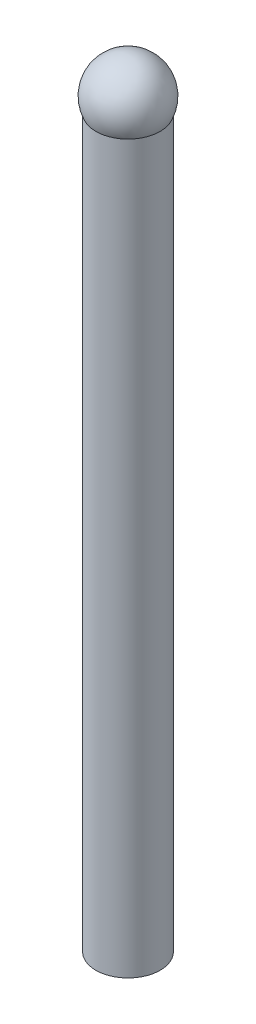
ISO-10303-21;
HEADER;
FILE_DESCRIPTION(('STEP AP214'),'2;1');
FILE_NAME('part.step','',(''),(''),'','','');
FILE_SCHEMA(('AUTOMOTIVE_DESIGN { 1 0 10303 214 1 1 1 1 }'));
ENDSEC;
DATA;
#1=APPLICATION_CONTEXT('core data for automotive mechanical design processes');
#2=APPLICATION_PROTOCOL_DEFINITION('international standard','automotive_design',2000,#1);
#3=PRODUCT_CONTEXT('',#1,'mechanical');
#4=PRODUCT('Part','Part','',(#3));
#5=PRODUCT_RELATED_PRODUCT_CATEGORY('part','',(#4));
#6=PRODUCT_DEFINITION_FORMATION('','',#4);
#7=PRODUCT_DEFINITION_CONTEXT('part definition',#1,'design');
#8=PRODUCT_DEFINITION('design','',#6,#7);
#9=PRODUCT_DEFINITION_SHAPE('','',#8);
#10=(LENGTH_UNIT() NAMED_UNIT(*) SI_UNIT(.MILLI.,.METRE.));
#11=(NAMED_UNIT(*) PLANE_ANGLE_UNIT() SI_UNIT($,.RADIAN.));
#12=(NAMED_UNIT(*) SI_UNIT($,.STERADIAN.) SOLID_ANGLE_UNIT());
#13=UNCERTAINTY_MEASURE_WITH_UNIT(LENGTH_MEASURE(1.E-05),#10,'distance_accuracy_value','');
#14=(GEOMETRIC_REPRESENTATION_CONTEXT(3) GLOBAL_UNCERTAINTY_ASSIGNED_CONTEXT((#13)) GLOBAL_UNIT_ASSIGNED_CONTEXT((#10,
#11,#12)) REPRESENTATION_CONTEXT('',''));
#15=CARTESIAN_POINT('',(0.,0.,0.));
#16=DIRECTION('',(0.,0.,1.));
#17=DIRECTION('',(1.,0.,0.));
#18=AXIS2_PLACEMENT_3D('',#15,#16,#17);
#19=CARTESIAN_POINT('',(0.,15.0008968470843,0.));
#20=DIRECTION('',(1.,0.,0.));
#21=DIRECTION('',(0.,-1.,0.));
#22=AXIS2_PLACEMENT_3D('',#19,#20,#21);
#23=SPHERICAL_SURFACE('',#22,0.715433282425515);
#24=CARTESIAN_POINT('',(0.,15.0008968470843,0.));
#25=DIRECTION('',(0.,1.,0.));
#26=DIRECTION('',(0.,0.,1.));
#27=AXIS2_PLACEMENT_3D('',#24,#25,#26);
#28=SPHERICAL_SURFACE('',#27,0.715433282425515);
#29=CARTESIAN_POINT('',(0.,14.701990872567,0.));
#30=DIRECTION('',(0.,0.999999999999998,0.));
#31=DIRECTION('',(0.,0.,1.));
#32=AXIS2_PLACEMENT_3D('',#29,#30,#31);
#33=CIRCLE('',#32,0.65);
#34=CARTESIAN_POINT('',(0.,14.701990872567,0.65));
#35=VERTEX_POINT('',#34);
#36=EDGE_CURVE('E36',#35,#35,#33,.F.);
#37=ORIENTED_EDGE('',*,*,#36,.F.);
#38=EDGE_LOOP('',(#37));
#39=FACE_BOUND('',#38,.T.);
#40=ADVANCED_FACE('F32',(#39),#28,.T.);
#41=CARTESIAN_POINT('',(0.,15.,0.));
#42=DIRECTION('',(0.,-1.,0.));
#43=DIRECTION('',(0.,0.,-1.));
#44=AXIS2_PLACEMENT_3D('',#41,#42,#43);
#45=CYLINDRICAL_SURFACE('',#44,0.65);
#46=ORIENTED_EDGE('',*,*,#36,.T.);
#47=EDGE_LOOP('',(#46));
#48=FACE_BOUND('',#47,.T.);
#49=CARTESIAN_POINT('',(0.,0.,0.));
#50=DIRECTION('',(0.,1.,0.));
#51=DIRECTION('',(0.,0.,1.));
#52=AXIS2_PLACEMENT_3D('',#49,#50,#51);
#53=CIRCLE('',#52,0.65);
#54=CARTESIAN_POINT('',(0.,0.,0.65));
#55=VERTEX_POINT('',#54);
#56=EDGE_CURVE('E10',#55,#55,#53,.T.);
#57=ORIENTED_EDGE('',*,*,#56,.T.);
#58=EDGE_LOOP('',(#57));
#59=FACE_BOUND('',#58,.T.);
#60=ADVANCED_FACE('F34',(#48,#59),#45,.T.);
#61=CARTESIAN_POINT('',(0.,0.,0.));
#62=DIRECTION('',(0.,1.,0.));
#63=DIRECTION('',(0.,0.,1.));
#64=AXIS2_PLACEMENT_3D('',#61,#62,#63);
#65=PLANE('',#64);
#66=ORIENTED_EDGE('',*,*,#56,.F.);
#67=EDGE_LOOP('',(#66));
#68=FACE_BOUND('',#67,.T.);
#69=ADVANCED_FACE('F51',(#68),#65,.F.);
#70=CLOSED_SHELL('',(#40,#60,#69));
#71=MANIFOLD_SOLID_BREP('B2',#70);
#72=ADVANCED_BREP_SHAPE_REPRESENTATION('',(#18,#71),#14);
#73=SHAPE_DEFINITION_REPRESENTATION(#9,#72);
ENDSEC;
END-ISO-10303-21;
